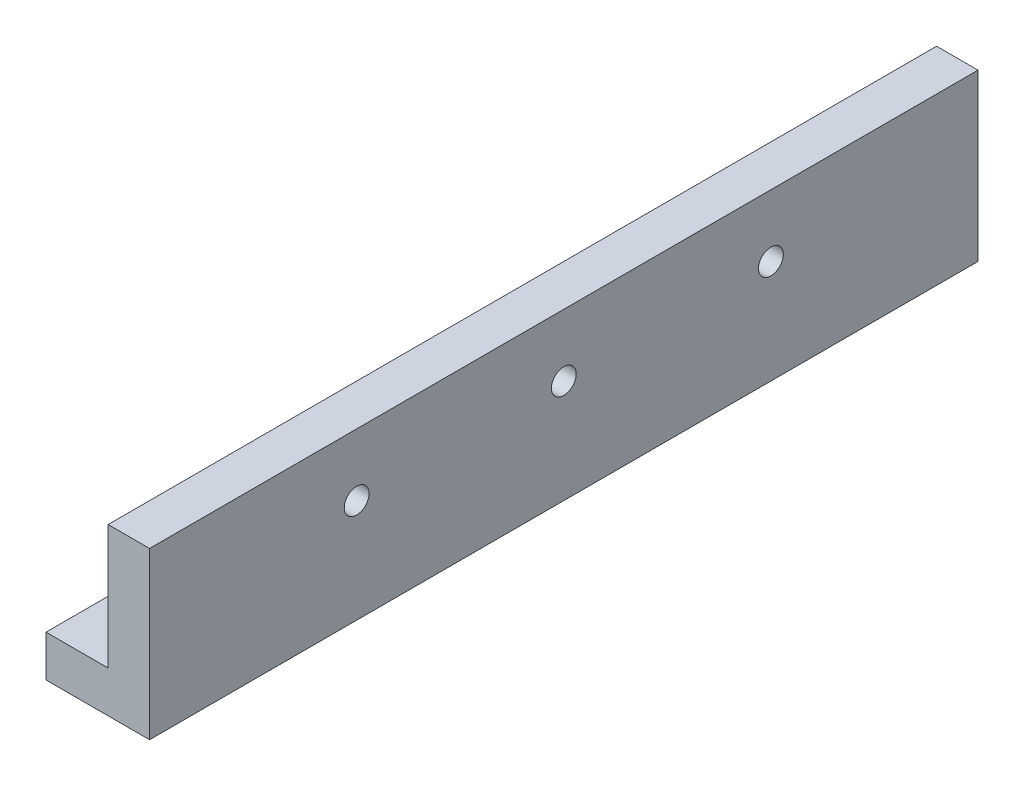
ISO-10303-21;
HEADER;
FILE_DESCRIPTION(('STEP AP214'),'2;1');
FILE_NAME('part.step','',(''),(''),'','','');
FILE_SCHEMA(('AUTOMOTIVE_DESIGN { 1 0 10303 214 1 1 1 1 }'));
ENDSEC;
DATA;
#1=APPLICATION_CONTEXT('core data for automotive mechanical design processes');
#2=APPLICATION_PROTOCOL_DEFINITION('international standard','automotive_design',2000,#1);
#3=PRODUCT_CONTEXT('',#1,'mechanical');
#4=PRODUCT('Part','Part','',(#3));
#5=PRODUCT_RELATED_PRODUCT_CATEGORY('part','',(#4));
#6=PRODUCT_DEFINITION_FORMATION('','',#4);
#7=PRODUCT_DEFINITION_CONTEXT('part definition',#1,'design');
#8=PRODUCT_DEFINITION('design','',#6,#7);
#9=PRODUCT_DEFINITION_SHAPE('','',#8);
#10=(LENGTH_UNIT() NAMED_UNIT(*) SI_UNIT(.MILLI.,.METRE.));
#11=(NAMED_UNIT(*) PLANE_ANGLE_UNIT() SI_UNIT($,.RADIAN.));
#12=(NAMED_UNIT(*) SI_UNIT($,.STERADIAN.) SOLID_ANGLE_UNIT());
#13=UNCERTAINTY_MEASURE_WITH_UNIT(LENGTH_MEASURE(1.E-05),#10,'distance_accuracy_value','');
#14=(GEOMETRIC_REPRESENTATION_CONTEXT(3) GLOBAL_UNCERTAINTY_ASSIGNED_CONTEXT((#13)) GLOBAL_UNIT_ASSIGNED_CONTEXT((#10,
#11,#12)) REPRESENTATION_CONTEXT('',''));
#15=CARTESIAN_POINT('',(0.,0.,0.));
#16=DIRECTION('',(0.,0.,1.));
#17=DIRECTION('',(1.,0.,0.));
#18=AXIS2_PLACEMENT_3D('',#15,#16,#17);
#19=CARTESIAN_POINT('',(4.66146532370146,191.771570680271,-200.));
#20=DIRECTION('',(0.,1.,0.));
#21=DIRECTION('',(0.,0.,1.));
#22=AXIS2_PLACEMENT_3D('',#19,#20,#21);
#23=PLANE('',#22);
#24=DIRECTION('',(-1.,0.,0.));
#25=VECTOR('',#24,1.);
#26=CARTESIAN_POINT('',(4.66146532370146,191.771570680271,0.));
#27=LINE('',#26,#25);
#28=CARTESIAN_POINT('',(4.66146532370146,191.771570680271,0.));
#29=VERTEX_POINT('',#28);
#30=CARTESIAN_POINT('',(-5.33853467629854,191.771570680271,0.));
#31=VERTEX_POINT('',#30);
#32=EDGE_CURVE('E118',#29,#31,#27,.T.);
#33=ORIENTED_EDGE('',*,*,#32,.F.);
#34=DIRECTION('',(0.,0.,1.));
#35=VECTOR('',#34,1.);
#36=CARTESIAN_POINT('',(4.66146532370146,191.771570680271,-200.));
#37=LINE('',#36,#35);
#38=CARTESIAN_POINT('',(4.66146532370146,191.771570680271,-200.));
#39=VERTEX_POINT('',#38);
#40=EDGE_CURVE('E11',#39,#29,#37,.T.);
#41=ORIENTED_EDGE('',*,*,#40,.F.);
#42=DIRECTION('',(-1.,0.,0.));
#43=VECTOR('',#42,1.);
#44=CARTESIAN_POINT('',(4.66146532370146,191.771570680271,-200.));
#45=LINE('',#44,#43);
#46=CARTESIAN_POINT('',(-5.33853467629854,191.771570680271,-200.));
#47=VERTEX_POINT('',#46);
#48=EDGE_CURVE('E133',#39,#47,#45,.T.);
#49=ORIENTED_EDGE('',*,*,#48,.T.);
#50=DIRECTION('',(0.,0.,1.));
#51=VECTOR('',#50,1.);
#52=CARTESIAN_POINT('',(-5.33853467629854,191.771570680271,-200.));
#53=LINE('',#52,#51);
#54=EDGE_CURVE('E36',#47,#31,#53,.T.);
#55=ORIENTED_EDGE('',*,*,#54,.T.);
#56=EDGE_LOOP('',(#33,#41,#49,#55));
#57=FACE_BOUND('',#56,.T.);
#58=ADVANCED_FACE('F33',(#57),#23,.T.);
#59=CARTESIAN_POINT('',(4.66146532370146,151.771570680271,-200.));
#60=DIRECTION('',(1.,0.,0.));
#61=DIRECTION('',(0.,1.,0.));
#62=AXIS2_PLACEMENT_3D('',#59,#60,#61);
#63=PLANE('',#62);
#64=CARTESIAN_POINT('',(4.66146532370146,176.771570680271,-100.));
#65=DIRECTION('',(1.,0.,0.));
#66=DIRECTION('',(0.,1.,0.));
#67=AXIS2_PLACEMENT_3D('',#64,#65,#66);
#68=CIRCLE('',#67,2.99999999999999);
#69=CARTESIAN_POINT('',(4.66146532370146,179.771570680271,-100.));
#70=VERTEX_POINT('',#69);
#71=EDGE_CURVE('E177',#70,#70,#68,.T.);
#72=ORIENTED_EDGE('',*,*,#71,.F.);
#73=EDGE_LOOP('',(#72));
#74=FACE_BOUND('',#73,.T.);
#75=CARTESIAN_POINT('',(4.66146532370146,176.771570680271,-50.));
#76=DIRECTION('',(1.,0.,0.));
#77=DIRECTION('',(0.,1.,0.));
#78=AXIS2_PLACEMENT_3D('',#75,#76,#77);
#79=CIRCLE('',#78,2.99999999999999);
#80=CARTESIAN_POINT('',(4.66146532370146,179.771570680271,-50.));
#81=VERTEX_POINT('',#80);
#82=EDGE_CURVE('E182',#81,#81,#79,.T.);
#83=ORIENTED_EDGE('',*,*,#82,.F.);
#84=EDGE_LOOP('',(#83));
#85=FACE_BOUND('',#84,.T.);
#86=CARTESIAN_POINT('',(4.66146532370146,176.771570680271,-150.));
#87=DIRECTION('',(1.,0.,0.));
#88=DIRECTION('',(0.,1.,0.));
#89=AXIS2_PLACEMENT_3D('',#86,#87,#88);
#90=CIRCLE('',#89,2.99999999999999);
#91=CARTESIAN_POINT('',(4.66146532370146,179.771570680271,-150.));
#92=VERTEX_POINT('',#91);
#93=EDGE_CURVE('E122',#92,#92,#90,.T.);
#94=ORIENTED_EDGE('',*,*,#93,.F.);
#95=EDGE_LOOP('',(#94));
#96=FACE_BOUND('',#95,.T.);
#97=DIRECTION('',(0.,1.,0.));
#98=VECTOR('',#97,1.);
#99=CARTESIAN_POINT('',(4.66146532370146,151.771570680271,0.));
#100=LINE('',#99,#98);
#101=CARTESIAN_POINT('',(4.66146532370146,151.771570680271,0.));
#102=VERTEX_POINT('',#101);
#103=EDGE_CURVE('E131',#102,#29,#100,.T.);
#104=ORIENTED_EDGE('',*,*,#103,.F.);
#105=DIRECTION('',(0.,0.,1.));
#106=VECTOR('',#105,1.);
#107=CARTESIAN_POINT('',(4.66146532370146,151.771570680271,-200.));
#108=LINE('',#107,#106);
#109=CARTESIAN_POINT('',(4.66146532370146,151.771570680271,-200.));
#110=VERTEX_POINT('',#109);
#111=EDGE_CURVE('E42',#110,#102,#108,.T.);
#112=ORIENTED_EDGE('',*,*,#111,.F.);
#113=DIRECTION('',(0.,1.,0.));
#114=VECTOR('',#113,1.);
#115=CARTESIAN_POINT('',(4.66146532370146,151.771570680271,-200.));
#116=LINE('',#115,#114);
#117=EDGE_CURVE('E108',#110,#39,#116,.T.);
#118=ORIENTED_EDGE('',*,*,#117,.T.);
#119=ORIENTED_EDGE('',*,*,#40,.T.);
#120=EDGE_LOOP('',(#104,#112,#118,#119));
#121=FACE_BOUND('',#120,.T.);
#122=ADVANCED_FACE('F141',(#74,#85,#96,#121),#63,.T.);
#123=CARTESIAN_POINT('',(-20.3385346762985,151.771570680271,-200.));
#124=DIRECTION('',(0.,-1.,0.));
#125=DIRECTION('',(0.,0.,-1.));
#126=AXIS2_PLACEMENT_3D('',#123,#124,#125);
#127=PLANE('',#126);
#128=DIRECTION('',(1.,0.,0.));
#129=VECTOR('',#128,1.);
#130=CARTESIAN_POINT('',(-20.3385346762985,151.771570680271,0.));
#131=LINE('',#130,#129);
#132=CARTESIAN_POINT('',(-20.3385346762985,151.771570680271,0.));
#133=VERTEX_POINT('',#132);
#134=EDGE_CURVE('E95',#133,#102,#131,.T.);
#135=ORIENTED_EDGE('',*,*,#134,.F.);
#136=DIRECTION('',(0.,0.,1.));
#137=VECTOR('',#136,1.);
#138=CARTESIAN_POINT('',(-20.3385346762985,151.771570680271,-200.));
#139=LINE('',#138,#137);
#140=CARTESIAN_POINT('',(-20.3385346762985,151.771570680271,-200.));
#141=VERTEX_POINT('',#140);
#142=EDGE_CURVE('E90',#141,#133,#139,.T.);
#143=ORIENTED_EDGE('',*,*,#142,.F.);
#144=DIRECTION('',(1.,0.,0.));
#145=VECTOR('',#144,1.);
#146=CARTESIAN_POINT('',(-20.3385346762985,151.771570680271,-200.));
#147=LINE('',#146,#145);
#148=EDGE_CURVE('E93',#141,#110,#147,.T.);
#149=ORIENTED_EDGE('',*,*,#148,.T.);
#150=ORIENTED_EDGE('',*,*,#111,.T.);
#151=EDGE_LOOP('',(#135,#143,#149,#150));
#152=FACE_BOUND('',#151,.T.);
#153=ADVANCED_FACE('F92',(#152),#127,.T.);
#154=CARTESIAN_POINT('',(-20.3385346762985,161.771570680271,-200.));
#155=DIRECTION('',(-1.,0.,0.));
#156=DIRECTION('',(0.,-1.,0.));
#157=AXIS2_PLACEMENT_3D('',#154,#155,#156);
#158=PLANE('',#157);
#159=DIRECTION('',(0.,-1.,0.));
#160=VECTOR('',#159,1.);
#161=CARTESIAN_POINT('',(-20.3385346762985,161.771570680271,0.));
#162=LINE('',#161,#160);
#163=CARTESIAN_POINT('',(-20.3385346762985,161.771570680271,0.));
#164=VERTEX_POINT('',#163);
#165=EDGE_CURVE('E128',#164,#133,#162,.T.);
#166=ORIENTED_EDGE('',*,*,#165,.F.);
#167=DIRECTION('',(0.,0.,1.));
#168=VECTOR('',#167,1.);
#169=CARTESIAN_POINT('',(-20.3385346762985,161.771570680271,-200.));
#170=LINE('',#169,#168);
#171=CARTESIAN_POINT('',(-20.3385346762985,161.771570680271,-200.));
#172=VERTEX_POINT('',#171);
#173=EDGE_CURVE('E100',#172,#164,#170,.T.);
#174=ORIENTED_EDGE('',*,*,#173,.F.);
#175=DIRECTION('',(0.,-1.,0.));
#176=VECTOR('',#175,1.);
#177=CARTESIAN_POINT('',(-20.3385346762985,161.771570680271,-200.));
#178=LINE('',#177,#176);
#179=EDGE_CURVE('E106',#172,#141,#178,.T.);
#180=ORIENTED_EDGE('',*,*,#179,.T.);
#181=ORIENTED_EDGE('',*,*,#142,.T.);
#182=EDGE_LOOP('',(#166,#174,#180,#181));
#183=FACE_BOUND('',#182,.T.);
#184=ADVANCED_FACE('F110',(#183),#158,.T.);
#185=CARTESIAN_POINT('',(-5.33853467629854,161.771570680271,-200.));
#186=DIRECTION('',(0.,1.,0.));
#187=DIRECTION('',(0.,0.,1.));
#188=AXIS2_PLACEMENT_3D('',#185,#186,#187);
#189=PLANE('',#188);
#190=DIRECTION('',(-1.,0.,0.));
#191=VECTOR('',#190,1.);
#192=CARTESIAN_POINT('',(-5.33853467629854,161.771570680271,0.));
#193=LINE('',#192,#191);
#194=CARTESIAN_POINT('',(-5.33853467629854,161.771570680271,0.));
#195=VERTEX_POINT('',#194);
#196=EDGE_CURVE('E125',#195,#164,#193,.T.);
#197=ORIENTED_EDGE('',*,*,#196,.F.);
#198=DIRECTION('',(0.,0.,1.));
#199=VECTOR('',#198,1.);
#200=CARTESIAN_POINT('',(-5.33853467629854,161.771570680271,-200.));
#201=LINE('',#200,#199);
#202=CARTESIAN_POINT('',(-5.33853467629854,161.771570680271,-200.));
#203=VERTEX_POINT('',#202);
#204=EDGE_CURVE('E136',#203,#195,#201,.T.);
#205=ORIENTED_EDGE('',*,*,#204,.F.);
#206=DIRECTION('',(-1.,0.,0.));
#207=VECTOR('',#206,1.);
#208=CARTESIAN_POINT('',(-5.33853467629854,161.771570680271,-200.));
#209=LINE('',#208,#207);
#210=EDGE_CURVE('E111',#203,#172,#209,.T.);
#211=ORIENTED_EDGE('',*,*,#210,.T.);
#212=ORIENTED_EDGE('',*,*,#173,.T.);
#213=EDGE_LOOP('',(#197,#205,#211,#212));
#214=FACE_BOUND('',#213,.T.);
#215=ADVANCED_FACE('F157',(#214),#189,.T.);
#216=CARTESIAN_POINT('',(-5.33853467629854,191.771570680271,-200.));
#217=DIRECTION('',(-1.,0.,0.));
#218=DIRECTION('',(0.,-1.,0.));
#219=AXIS2_PLACEMENT_3D('',#216,#217,#218);
#220=PLANE('',#219);
#221=CARTESIAN_POINT('',(-5.33853467629854,176.771570680271,-100.));
#222=DIRECTION('',(-1.,0.,0.));
#223=DIRECTION('',(0.,-1.,0.));
#224=AXIS2_PLACEMENT_3D('',#221,#222,#223);
#225=CIRCLE('',#224,2.99999999999999);
#226=CARTESIAN_POINT('',(-5.33853467629854,173.771570680271,-100.));
#227=VERTEX_POINT('',#226);
#228=EDGE_CURVE('E168',#227,#227,#225,.F.);
#229=ORIENTED_EDGE('',*,*,#228,.T.);
#230=EDGE_LOOP('',(#229));
#231=FACE_BOUND('',#230,.T.);
#232=CARTESIAN_POINT('',(-5.33853467629854,176.771570680271,-50.));
#233=DIRECTION('',(-1.,0.,0.));
#234=DIRECTION('',(0.,-1.,0.));
#235=AXIS2_PLACEMENT_3D('',#232,#233,#234);
#236=CIRCLE('',#235,2.99999999999999);
#237=CARTESIAN_POINT('',(-5.33853467629854,173.771570680271,-50.));
#238=VERTEX_POINT('',#237);
#239=EDGE_CURVE('E172',#238,#238,#236,.F.);
#240=ORIENTED_EDGE('',*,*,#239,.T.);
#241=EDGE_LOOP('',(#240));
#242=FACE_BOUND('',#241,.T.);
#243=CARTESIAN_POINT('',(-5.33853467629854,176.771570680271,-150.));
#244=DIRECTION('',(-1.,0.,0.));
#245=DIRECTION('',(0.,-1.,0.));
#246=AXIS2_PLACEMENT_3D('',#243,#244,#245);
#247=CIRCLE('',#246,2.99999999999999);
#248=CARTESIAN_POINT('',(-5.33853467629854,173.771570680271,-150.));
#249=VERTEX_POINT('',#248);
#250=EDGE_CURVE('E175',#249,#249,#247,.F.);
#251=ORIENTED_EDGE('',*,*,#250,.T.);
#252=EDGE_LOOP('',(#251));
#253=FACE_BOUND('',#252,.T.);
#254=DIRECTION('',(0.,-1.,0.));
#255=VECTOR('',#254,1.);
#256=CARTESIAN_POINT('',(-5.33853467629854,191.771570680271,0.));
#257=LINE('',#256,#255);
#258=EDGE_CURVE('E121',#31,#195,#257,.T.);
#259=ORIENTED_EDGE('',*,*,#258,.F.);
#260=ORIENTED_EDGE('',*,*,#54,.F.);
#261=DIRECTION('',(0.,-1.,0.));
#262=VECTOR('',#261,1.);
#263=CARTESIAN_POINT('',(-5.33853467629854,191.771570680271,-200.));
#264=LINE('',#263,#262);
#265=EDGE_CURVE('E113',#47,#203,#264,.T.);
#266=ORIENTED_EDGE('',*,*,#265,.T.);
#267=ORIENTED_EDGE('',*,*,#204,.T.);
#268=EDGE_LOOP('',(#259,#260,#266,#267));
#269=FACE_BOUND('',#268,.T.);
#270=ADVANCED_FACE('F138',(#231,#242,#253,#269),#220,.T.);
#271=CARTESIAN_POINT('',(0.,0.,-200.));
#272=DIRECTION('',(0.,0.,1.));
#273=DIRECTION('',(1.,0.,0.));
#274=AXIS2_PLACEMENT_3D('',#271,#272,#273);
#275=PLANE('',#274);
#276=ORIENTED_EDGE('',*,*,#48,.F.);
#277=ORIENTED_EDGE('',*,*,#117,.F.);
#278=ORIENTED_EDGE('',*,*,#148,.F.);
#279=ORIENTED_EDGE('',*,*,#179,.F.);
#280=ORIENTED_EDGE('',*,*,#210,.F.);
#281=ORIENTED_EDGE('',*,*,#265,.F.);
#282=EDGE_LOOP('',(#276,#277,#278,#279,#280,#281));
#283=FACE_BOUND('',#282,.T.);
#284=ADVANCED_FACE('F104',(#283),#275,.F.);
#285=CARTESIAN_POINT('',(0.,0.,0.));
#286=DIRECTION('',(0.,0.,1.));
#287=DIRECTION('',(1.,0.,0.));
#288=AXIS2_PLACEMENT_3D('',#285,#286,#287);
#289=PLANE('',#288);
#290=ORIENTED_EDGE('',*,*,#32,.T.);
#291=ORIENTED_EDGE('',*,*,#258,.T.);
#292=ORIENTED_EDGE('',*,*,#196,.T.);
#293=ORIENTED_EDGE('',*,*,#165,.T.);
#294=ORIENTED_EDGE('',*,*,#134,.T.);
#295=ORIENTED_EDGE('',*,*,#103,.T.);
#296=EDGE_LOOP('',(#290,#291,#292,#293,#294,#295));
#297=FACE_BOUND('',#296,.T.);
#298=ADVANCED_FACE('F140',(#297),#289,.T.);
#299=CARTESIAN_POINT('',(-13.8238160505371,176.771570680271,-150.));
#300=DIRECTION('',(1.,0.,0.));
#301=DIRECTION('',(0.,1.,0.));
#302=AXIS2_PLACEMENT_3D('',#299,#300,#301);
#303=CYLINDRICAL_SURFACE('',#302,2.99999999999999);
#304=ORIENTED_EDGE('',*,*,#93,.T.);
#305=EDGE_LOOP('',(#304));
#306=FACE_BOUND('',#305,.T.);
#307=ORIENTED_EDGE('',*,*,#250,.F.);
#308=EDGE_LOOP('',(#307));
#309=FACE_BOUND('',#308,.T.);
#310=ADVANCED_FACE('F196',(#306,#309),#303,.F.);
#311=CARTESIAN_POINT('',(-13.8238160505371,176.771570680271,-50.));
#312=DIRECTION('',(1.,0.,0.));
#313=DIRECTION('',(0.,1.,0.));
#314=AXIS2_PLACEMENT_3D('',#311,#312,#313);
#315=CYLINDRICAL_SURFACE('',#314,2.99999999999999);
#316=ORIENTED_EDGE('',*,*,#82,.T.);
#317=EDGE_LOOP('',(#316));
#318=FACE_BOUND('',#317,.T.);
#319=ORIENTED_EDGE('',*,*,#239,.F.);
#320=EDGE_LOOP('',(#319));
#321=FACE_BOUND('',#320,.T.);
#322=ADVANCED_FACE('F191',(#318,#321),#315,.F.);
#323=CARTESIAN_POINT('',(-13.8238160505371,176.771570680271,-100.));
#324=DIRECTION('',(1.,0.,0.));
#325=DIRECTION('',(0.,1.,0.));
#326=AXIS2_PLACEMENT_3D('',#323,#324,#325);
#327=CYLINDRICAL_SURFACE('',#326,2.99999999999999);
#328=ORIENTED_EDGE('',*,*,#71,.T.);
#329=EDGE_LOOP('',(#328));
#330=FACE_BOUND('',#329,.T.);
#331=ORIENTED_EDGE('',*,*,#228,.F.);
#332=EDGE_LOOP('',(#331));
#333=FACE_BOUND('',#332,.T.);
#334=ADVANCED_FACE('F203',(#330,#333),#327,.F.);
#335=CLOSED_SHELL('',(#58,#122,#153,#184,#215,#270,#284,#298,#310,#322,#334));
#336=MANIFOLD_SOLID_BREP('B2',#335);
#337=ADVANCED_BREP_SHAPE_REPRESENTATION('',(#18,#336),#14);
#338=SHAPE_DEFINITION_REPRESENTATION(#9,#337);
ENDSEC;
END-ISO-10303-21;
